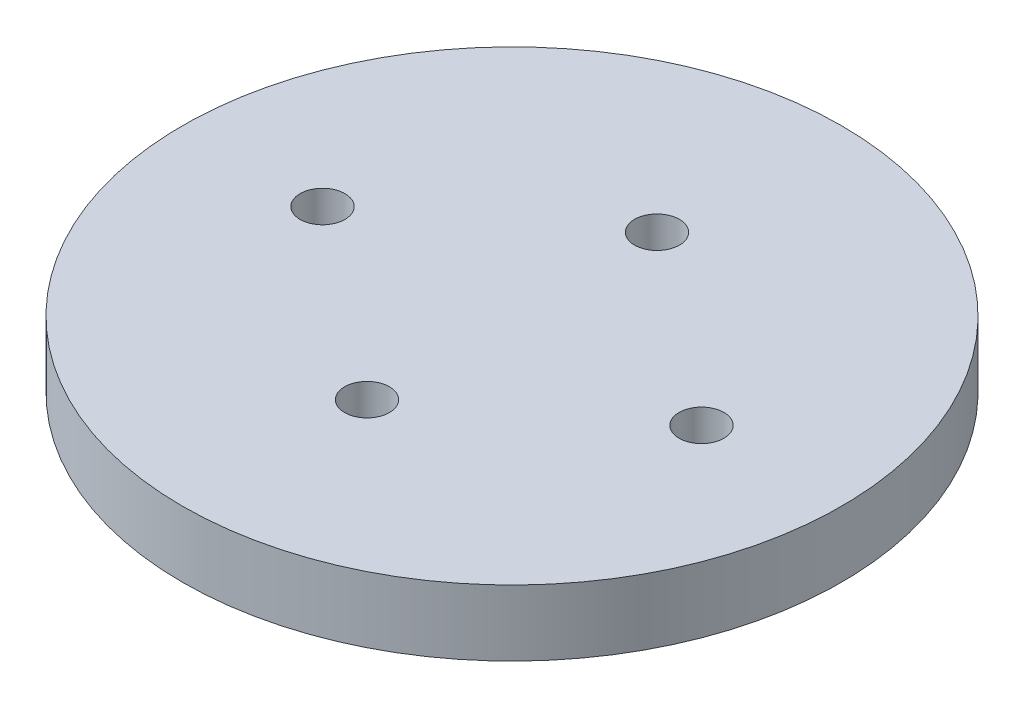
ISO-10303-21;
HEADER;
FILE_DESCRIPTION(('STEP AP214'),'2;1');
FILE_NAME('part.step','',(''),(''),'','','');
FILE_SCHEMA(('AUTOMOTIVE_DESIGN { 1 0 10303 214 1 1 1 1 }'));
ENDSEC;
DATA;
#1=APPLICATION_CONTEXT('core data for automotive mechanical design processes');
#2=APPLICATION_PROTOCOL_DEFINITION('international standard','automotive_design',2000,#1);
#3=PRODUCT_CONTEXT('',#1,'mechanical');
#4=PRODUCT('Part','Part','',(#3));
#5=PRODUCT_RELATED_PRODUCT_CATEGORY('part','',(#4));
#6=PRODUCT_DEFINITION_FORMATION('','',#4);
#7=PRODUCT_DEFINITION_CONTEXT('part definition',#1,'design');
#8=PRODUCT_DEFINITION('design','',#6,#7);
#9=PRODUCT_DEFINITION_SHAPE('','',#8);
#10=(LENGTH_UNIT() NAMED_UNIT(*) SI_UNIT(.MILLI.,.METRE.));
#11=(NAMED_UNIT(*) PLANE_ANGLE_UNIT() SI_UNIT($,.RADIAN.));
#12=(NAMED_UNIT(*) SI_UNIT($,.STERADIAN.) SOLID_ANGLE_UNIT());
#13=UNCERTAINTY_MEASURE_WITH_UNIT(LENGTH_MEASURE(1.E-05),#10,'distance_accuracy_value','');
#14=(GEOMETRIC_REPRESENTATION_CONTEXT(3) GLOBAL_UNCERTAINTY_ASSIGNED_CONTEXT((#13)) GLOBAL_UNIT_ASSIGNED_CONTEXT((#10,
#11,#12)) REPRESENTATION_CONTEXT('',''));
#15=CARTESIAN_POINT('',(0.,0.,0.));
#16=DIRECTION('',(0.,0.,1.));
#17=DIRECTION('',(1.,0.,0.));
#18=AXIS2_PLACEMENT_3D('',#15,#16,#17);
#19=CARTESIAN_POINT('',(0.,5.,0.));
#20=DIRECTION('',(0.,-1.,0.));
#21=DIRECTION('',(0.,0.,-1.));
#22=AXIS2_PLACEMENT_3D('',#19,#20,#21);
#23=CYLINDRICAL_SURFACE('',#22,25.);
#24=CARTESIAN_POINT('',(0.,5.,0.));
#25=DIRECTION('',(0.,1.,0.));
#26=DIRECTION('',(0.,0.,1.));
#27=AXIS2_PLACEMENT_3D('',#24,#25,#26);
#28=CIRCLE('',#27,25.);
#29=CARTESIAN_POINT('',(0.,5.,25.));
#30=VERTEX_POINT('',#29);
#31=EDGE_CURVE('E47',#30,#30,#28,.T.);
#32=ORIENTED_EDGE('',*,*,#31,.F.);
#33=EDGE_LOOP('',(#32));
#34=FACE_BOUND('',#33,.T.);
#35=CARTESIAN_POINT('',(0.,0.,0.));
#36=DIRECTION('',(0.,1.,0.));
#37=DIRECTION('',(0.,0.,1.));
#38=AXIS2_PLACEMENT_3D('',#35,#36,#37);
#39=CIRCLE('',#38,25.);
#40=CARTESIAN_POINT('',(0.,0.,25.));
#41=VERTEX_POINT('',#40);
#42=EDGE_CURVE('E64',#41,#41,#39,.T.);
#43=ORIENTED_EDGE('',*,*,#42,.T.);
#44=EDGE_LOOP('',(#43));
#45=FACE_BOUND('',#44,.T.);
#46=ADVANCED_FACE('F39',(#34,#45),#23,.T.);
#47=CARTESIAN_POINT('',(-14.375,5.,0.));
#48=DIRECTION('',(0.,-1.,0.));
#49=DIRECTION('',(0.,0.,-1.));
#50=AXIS2_PLACEMENT_3D('',#47,#48,#49);
#51=CYLINDRICAL_SURFACE('',#50,1.7);
#52=CARTESIAN_POINT('',(-14.375,5.,0.));
#53=DIRECTION('',(0.,1.,0.));
#54=DIRECTION('',(0.,0.,1.));
#55=AXIS2_PLACEMENT_3D('',#52,#53,#54);
#56=CIRCLE('',#55,1.7);
#57=CARTESIAN_POINT('',(-14.375,5.,1.7));
#58=VERTEX_POINT('',#57);
#59=EDGE_CURVE('E52',#58,#58,#56,.T.);
#60=ORIENTED_EDGE('',*,*,#59,.T.);
#61=EDGE_LOOP('',(#60));
#62=FACE_BOUND('',#61,.T.);
#63=CARTESIAN_POINT('',(-14.375,0.,0.));
#64=DIRECTION('',(0.,1.,0.));
#65=DIRECTION('',(0.,0.,1.));
#66=AXIS2_PLACEMENT_3D('',#63,#64,#65);
#67=CIRCLE('',#66,1.7);
#68=CARTESIAN_POINT('',(-14.375,0.,1.7));
#69=VERTEX_POINT('',#68);
#70=EDGE_CURVE('E62',#69,#69,#67,.T.);
#71=ORIENTED_EDGE('',*,*,#70,.F.);
#72=EDGE_LOOP('',(#71));
#73=FACE_BOUND('',#72,.T.);
#74=ADVANCED_FACE('F82',(#62,#73),#51,.F.);
#75=CARTESIAN_POINT('',(0.,5.,-11.));
#76=DIRECTION('',(0.,-1.,0.));
#77=DIRECTION('',(0.,0.,-1.));
#78=AXIS2_PLACEMENT_3D('',#75,#76,#77);
#79=CYLINDRICAL_SURFACE('',#78,1.7);
#80=CARTESIAN_POINT('',(0.,5.,-11.));
#81=DIRECTION('',(0.,1.,0.));
#82=DIRECTION('',(0.,0.,1.));
#83=AXIS2_PLACEMENT_3D('',#80,#81,#82);
#84=CIRCLE('',#83,1.7);
#85=CARTESIAN_POINT('',(0.,5.,-9.3));
#86=VERTEX_POINT('',#85);
#87=EDGE_CURVE('E73',#86,#86,#84,.T.);
#88=ORIENTED_EDGE('',*,*,#87,.T.);
#89=EDGE_LOOP('',(#88));
#90=FACE_BOUND('',#89,.T.);
#91=CARTESIAN_POINT('',(0.,0.,-11.));
#92=DIRECTION('',(0.,1.,0.));
#93=DIRECTION('',(0.,0.,1.));
#94=AXIS2_PLACEMENT_3D('',#91,#92,#93);
#95=CIRCLE('',#94,1.7);
#96=CARTESIAN_POINT('',(0.,0.,-9.3));
#97=VERTEX_POINT('',#96);
#98=EDGE_CURVE('E59',#97,#97,#95,.T.);
#99=ORIENTED_EDGE('',*,*,#98,.F.);
#100=EDGE_LOOP('',(#99));
#101=FACE_BOUND('',#100,.T.);
#102=ADVANCED_FACE('F98',(#90,#101),#79,.F.);
#103=CARTESIAN_POINT('',(0.,5.,11.));
#104=DIRECTION('',(0.,-1.,0.));
#105=DIRECTION('',(0.,0.,-1.));
#106=AXIS2_PLACEMENT_3D('',#103,#104,#105);
#107=CYLINDRICAL_SURFACE('',#106,1.7);
#108=CARTESIAN_POINT('',(0.,5.,11.));
#109=DIRECTION('',(0.,1.,0.));
#110=DIRECTION('',(0.,0.,1.));
#111=AXIS2_PLACEMENT_3D('',#108,#109,#110);
#112=CIRCLE('',#111,1.7);
#113=CARTESIAN_POINT('',(0.,5.,12.7));
#114=VERTEX_POINT('',#113);
#115=EDGE_CURVE('E69',#114,#114,#112,.F.);
#116=ORIENTED_EDGE('',*,*,#115,.F.);
#117=EDGE_LOOP('',(#116));
#118=FACE_BOUND('',#117,.T.);
#119=CARTESIAN_POINT('',(0.,0.,11.));
#120=DIRECTION('',(0.,1.,0.));
#121=DIRECTION('',(0.,0.,1.));
#122=AXIS2_PLACEMENT_3D('',#119,#120,#121);
#123=CIRCLE('',#122,1.7);
#124=CARTESIAN_POINT('',(0.,0.,12.7));
#125=VERTEX_POINT('',#124);
#126=EDGE_CURVE('E56',#125,#125,#123,.F.);
#127=ORIENTED_EDGE('',*,*,#126,.T.);
#128=EDGE_LOOP('',(#127));
#129=FACE_BOUND('',#128,.T.);
#130=ADVANCED_FACE('F41',(#118,#129),#107,.F.);
#131=CARTESIAN_POINT('',(14.375,5.,0.));
#132=DIRECTION('',(0.,-1.,0.));
#133=DIRECTION('',(0.,0.,-1.));
#134=AXIS2_PLACEMENT_3D('',#131,#132,#133);
#135=CYLINDRICAL_SURFACE('',#134,1.7);
#136=CARTESIAN_POINT('',(14.375,5.,0.));
#137=DIRECTION('',(0.,1.,0.));
#138=DIRECTION('',(0.,0.,1.));
#139=AXIS2_PLACEMENT_3D('',#136,#137,#138);
#140=CIRCLE('',#139,1.7);
#141=CARTESIAN_POINT('',(14.375,5.,1.7));
#142=VERTEX_POINT('',#141);
#143=EDGE_CURVE('E10',#142,#142,#140,.F.);
#144=ORIENTED_EDGE('',*,*,#143,.F.);
#145=EDGE_LOOP('',(#144));
#146=FACE_BOUND('',#145,.T.);
#147=CARTESIAN_POINT('',(14.375,0.,0.));
#148=DIRECTION('',(0.,1.,0.));
#149=DIRECTION('',(0.,0.,1.));
#150=AXIS2_PLACEMENT_3D('',#147,#148,#149);
#151=CIRCLE('',#150,1.7);
#152=CARTESIAN_POINT('',(14.375,0.,1.7));
#153=VERTEX_POINT('',#152);
#154=EDGE_CURVE('E43',#153,#153,#151,.F.);
#155=ORIENTED_EDGE('',*,*,#154,.T.);
#156=EDGE_LOOP('',(#155));
#157=FACE_BOUND('',#156,.T.);
#158=ADVANCED_FACE('F89',(#146,#157),#135,.F.);
#159=CARTESIAN_POINT('',(0.,5.,0.));
#160=DIRECTION('',(0.,1.,0.));
#161=DIRECTION('',(0.,0.,1.));
#162=AXIS2_PLACEMENT_3D('',#159,#160,#161);
#163=PLANE('',#162);
#164=ORIENTED_EDGE('',*,*,#115,.T.);
#165=EDGE_LOOP('',(#164));
#166=FACE_BOUND('',#165,.T.);
#167=ORIENTED_EDGE('',*,*,#87,.F.);
#168=EDGE_LOOP('',(#167));
#169=FACE_BOUND('',#168,.T.);
#170=ORIENTED_EDGE('',*,*,#59,.F.);
#171=EDGE_LOOP('',(#170));
#172=FACE_BOUND('',#171,.T.);
#173=ORIENTED_EDGE('',*,*,#31,.T.);
#174=EDGE_LOOP('',(#173));
#175=FACE_BOUND('',#174,.T.);
#176=ORIENTED_EDGE('',*,*,#143,.T.);
#177=EDGE_LOOP('',(#176));
#178=FACE_BOUND('',#177,.T.);
#179=ADVANCED_FACE('F85',(#166,#169,#172,#175,#178),#163,.T.);
#180=CARTESIAN_POINT('',(0.,0.,0.));
#181=DIRECTION('',(0.,1.,0.));
#182=DIRECTION('',(0.,0.,1.));
#183=AXIS2_PLACEMENT_3D('',#180,#181,#182);
#184=PLANE('',#183);
#185=ORIENTED_EDGE('',*,*,#126,.F.);
#186=EDGE_LOOP('',(#185));
#187=FACE_BOUND('',#186,.T.);
#188=ORIENTED_EDGE('',*,*,#98,.T.);
#189=EDGE_LOOP('',(#188));
#190=FACE_BOUND('',#189,.T.);
#191=ORIENTED_EDGE('',*,*,#70,.T.);
#192=EDGE_LOOP('',(#191));
#193=FACE_BOUND('',#192,.T.);
#194=ORIENTED_EDGE('',*,*,#42,.F.);
#195=EDGE_LOOP('',(#194));
#196=FACE_BOUND('',#195,.T.);
#197=ORIENTED_EDGE('',*,*,#154,.F.);
#198=EDGE_LOOP('',(#197));
#199=FACE_BOUND('',#198,.T.);
#200=ADVANCED_FACE('F88',(#187,#190,#193,#196,#199),#184,.F.);
#201=CLOSED_SHELL('',(#46,#74,#102,#130,#158,#179,#200));
#202=MANIFOLD_SOLID_BREP('B2',#201);
#203=ADVANCED_BREP_SHAPE_REPRESENTATION('',(#18,#202),#14);
#204=SHAPE_DEFINITION_REPRESENTATION(#9,#203);
ENDSEC;
END-ISO-10303-21;
